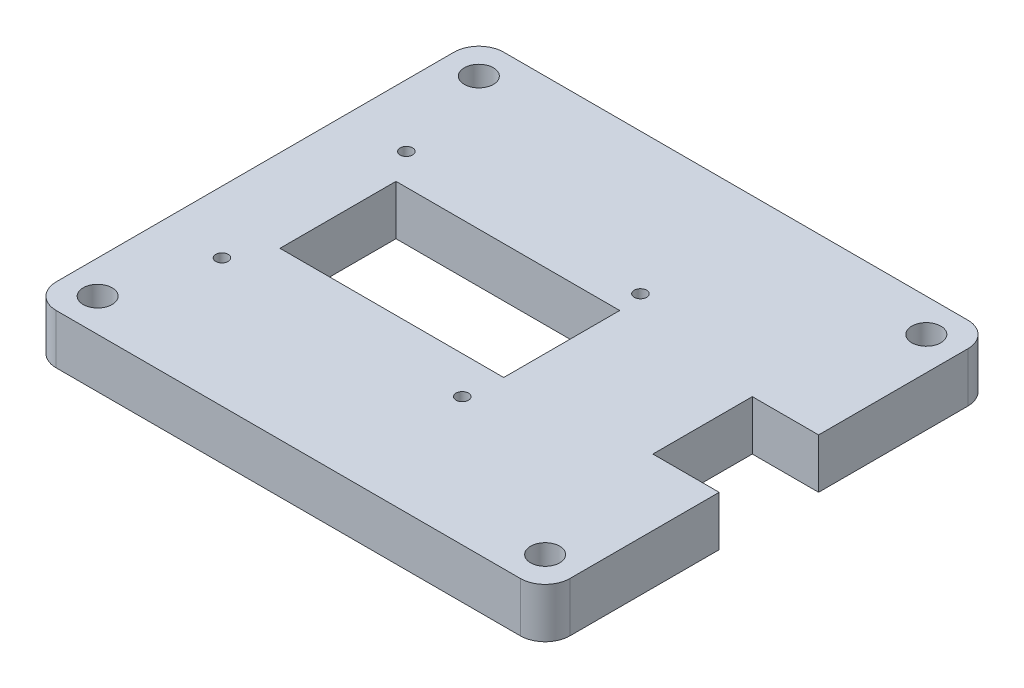
ISO-10303-21;
HEADER;
FILE_DESCRIPTION(('STEP AP214'),'2;1');
FILE_NAME('part.step','',(''),(''),'','','');
FILE_SCHEMA(('AUTOMOTIVE_DESIGN { 1 0 10303 214 1 1 1 1 }'));
ENDSEC;
DATA;
#1=APPLICATION_CONTEXT('core data for automotive mechanical design processes');
#2=APPLICATION_PROTOCOL_DEFINITION('international standard','automotive_design',2000,#1);
#3=PRODUCT_CONTEXT('',#1,'mechanical');
#4=PRODUCT('Part','Part','',(#3));
#5=PRODUCT_RELATED_PRODUCT_CATEGORY('part','',(#4));
#6=PRODUCT_DEFINITION_FORMATION('','',#4);
#7=PRODUCT_DEFINITION_CONTEXT('part definition',#1,'design');
#8=PRODUCT_DEFINITION('design','',#6,#7);
#9=PRODUCT_DEFINITION_SHAPE('','',#8);
#10=(LENGTH_UNIT() NAMED_UNIT(*) SI_UNIT(.MILLI.,.METRE.));
#11=(NAMED_UNIT(*) PLANE_ANGLE_UNIT() SI_UNIT($,.RADIAN.));
#12=(NAMED_UNIT(*) SI_UNIT($,.STERADIAN.) SOLID_ANGLE_UNIT());
#13=UNCERTAINTY_MEASURE_WITH_UNIT(LENGTH_MEASURE(1.E-05),#10,'distance_accuracy_value','');
#14=(GEOMETRIC_REPRESENTATION_CONTEXT(3) GLOBAL_UNCERTAINTY_ASSIGNED_CONTEXT((#13)) GLOBAL_UNIT_ASSIGNED_CONTEXT((#10,
#11,#12)) REPRESENTATION_CONTEXT('',''));
#15=CARTESIAN_POINT('',(0.,0.,0.));
#16=DIRECTION('',(0.,0.,1.));
#17=DIRECTION('',(1.,0.,0.));
#18=AXIS2_PLACEMENT_3D('',#15,#16,#17);
#19=CARTESIAN_POINT('',(52.,6.,-20.));
#20=DIRECTION('',(-1.,0.,0.));
#21=DIRECTION('',(0.,0.,1.));
#22=AXIS2_PLACEMENT_3D('',#19,#20,#21);
#23=PLANE('',#22);
#24=DIRECTION('',(0.,0.,-1.));
#25=VECTOR('',#24,1.);
#26=CARTESIAN_POINT('',(52.,6.,-20.));
#27=LINE('',#26,#25);
#28=CARTESIAN_POINT('',(52.,6.,1.));
#29=VERTEX_POINT('',#28);
#30=CARTESIAN_POINT('',(52.,6.,-17.));
#31=VERTEX_POINT('',#30);
#32=EDGE_CURVE('E56',#29,#31,#27,.T.);
#33=ORIENTED_EDGE('',*,*,#32,.F.);
#34=DIRECTION('',(0.,-1.,0.));
#35=VECTOR('',#34,1.);
#36=CARTESIAN_POINT('',(52.,6.,1.));
#37=LINE('',#36,#35);
#38=CARTESIAN_POINT('',(52.,0.,1.));
#39=VERTEX_POINT('',#38);
#40=EDGE_CURVE('E11',#29,#39,#37,.T.);
#41=ORIENTED_EDGE('',*,*,#40,.T.);
#42=DIRECTION('',(0.,0.,-1.));
#43=VECTOR('',#42,1.);
#44=CARTESIAN_POINT('',(52.,0.,-20.));
#45=LINE('',#44,#43);
#46=CARTESIAN_POINT('',(52.,0.,-17.));
#47=VERTEX_POINT('',#46);
#48=EDGE_CURVE('E276',#39,#47,#45,.T.);
#49=ORIENTED_EDGE('',*,*,#48,.T.);
#50=DIRECTION('',(0.,-1.,0.));
#51=VECTOR('',#50,1.);
#52=CARTESIAN_POINT('',(52.,6.,-17.));
#53=LINE('',#52,#51);
#54=EDGE_CURVE('E315',#47,#31,#53,.F.);
#55=ORIENTED_EDGE('',*,*,#54,.T.);
#56=EDGE_LOOP('',(#33,#41,#49,#55));
#57=FACE_BOUND('',#56,.T.);
#58=ADVANCED_FACE('F33',(#57),#23,.F.);
#59=CARTESIAN_POINT('',(0.,6.,0.));
#60=DIRECTION('',(0.,1.,0.));
#61=DIRECTION('',(0.,0.,1.));
#62=AXIS2_PLACEMENT_3D('',#59,#60,#61);
#63=PLANE('',#62);
#64=DIRECTION('',(-1.,0.,0.));
#65=VECTOR('',#64,1.);
#66=CARTESIAN_POINT('',(60.,6.,1.));
#67=LINE('',#66,#65);
#68=CARTESIAN_POINT('',(44.,6.,1.));
#69=VERTEX_POINT('',#68);
#70=EDGE_CURVE('E169',#29,#69,#67,.T.);
#71=ORIENTED_EDGE('',*,*,#70,.F.);
#72=ORIENTED_EDGE('',*,*,#32,.T.);
#73=CARTESIAN_POINT('',(49.,6.,-17.));
#74=DIRECTION('',(0.,1.,0.));
#75=DIRECTION('',(0.,0.,1.));
#76=AXIS2_PLACEMENT_3D('',#73,#74,#75);
#77=CIRCLE('',#76,3.);
#78=CARTESIAN_POINT('',(49.,6.,-20.));
#79=VERTEX_POINT('',#78);
#80=EDGE_CURVE('E301',#31,#79,#77,.T.);
#81=ORIENTED_EDGE('',*,*,#80,.T.);
#82=DIRECTION('',(-1.,0.,0.));
#83=VECTOR('',#82,1.);
#84=CARTESIAN_POINT('',(-10.,6.,-20.));
#85=LINE('',#84,#83);
#86=CARTESIAN_POINT('',(-7.,6.,-20.));
#87=VERTEX_POINT('',#86);
#88=EDGE_CURVE('E267',#79,#87,#85,.T.);
#89=ORIENTED_EDGE('',*,*,#88,.T.);
#90=CARTESIAN_POINT('',(-7.,6.,-17.));
#91=DIRECTION('',(0.,1.,0.));
#92=DIRECTION('',(0.,0.,1.));
#93=AXIS2_PLACEMENT_3D('',#90,#91,#92);
#94=CIRCLE('',#93,3.);
#95=CARTESIAN_POINT('',(-10.,6.,-17.));
#96=VERTEX_POINT('',#95);
#97=EDGE_CURVE('E305',#87,#96,#94,.T.);
#98=ORIENTED_EDGE('',*,*,#97,.T.);
#99=DIRECTION('',(0.,0.,1.));
#100=VECTOR('',#99,1.);
#101=CARTESIAN_POINT('',(-10.,6.,-20.));
#102=LINE('',#101,#100);
#103=CARTESIAN_POINT('',(-10.,6.,31.));
#104=VERTEX_POINT('',#103);
#105=EDGE_CURVE('E257',#96,#104,#102,.T.);
#106=ORIENTED_EDGE('',*,*,#105,.T.);
#107=CARTESIAN_POINT('',(-7.,6.,31.));
#108=DIRECTION('',(0.,1.,0.));
#109=DIRECTION('',(0.,0.,1.));
#110=AXIS2_PLACEMENT_3D('',#107,#108,#109);
#111=CIRCLE('',#110,3.);
#112=CARTESIAN_POINT('',(-7.,6.,34.));
#113=VERTEX_POINT('',#112);
#114=EDGE_CURVE('E303',#104,#113,#111,.T.);
#115=ORIENTED_EDGE('',*,*,#114,.T.);
#116=DIRECTION('',(1.,0.,0.));
#117=VECTOR('',#116,1.);
#118=CARTESIAN_POINT('',(-10.,6.,34.));
#119=LINE('',#118,#117);
#120=CARTESIAN_POINT('',(49.,6.,34.));
#121=VERTEX_POINT('',#120);
#122=EDGE_CURVE('E260',#113,#121,#119,.T.);
#123=ORIENTED_EDGE('',*,*,#122,.T.);
#124=CARTESIAN_POINT('',(49.,6.,31.));
#125=DIRECTION('',(0.,1.,0.));
#126=DIRECTION('',(0.,0.,1.));
#127=AXIS2_PLACEMENT_3D('',#124,#125,#126);
#128=CIRCLE('',#127,3.);
#129=CARTESIAN_POINT('',(52.,6.,31.));
#130=VERTEX_POINT('',#129);
#131=EDGE_CURVE('E299',#121,#130,#128,.T.);
#132=ORIENTED_EDGE('',*,*,#131,.T.);
#133=CARTESIAN_POINT('',(52.,6.,13.));
#134=VERTEX_POINT('',#133);
#135=EDGE_CURVE('E264',#130,#134,#27,.T.);
#136=ORIENTED_EDGE('',*,*,#135,.T.);
#137=DIRECTION('',(1.,0.,0.));
#138=VECTOR('',#137,1.);
#139=CARTESIAN_POINT('',(60.,6.,13.));
#140=LINE('',#139,#138);
#141=CARTESIAN_POINT('',(44.,6.,13.));
#142=VERTEX_POINT('',#141);
#143=EDGE_CURVE('E48',#142,#134,#140,.T.);
#144=ORIENTED_EDGE('',*,*,#143,.F.);
#145=DIRECTION('',(0.,0.,1.));
#146=VECTOR('',#145,1.);
#147=CARTESIAN_POINT('',(44.,6.,13.));
#148=LINE('',#147,#146);
#149=EDGE_CURVE('E155',#69,#142,#148,.T.);
#150=ORIENTED_EDGE('',*,*,#149,.F.);
#151=EDGE_LOOP('',(#71,#72,#81,#89,#98,#106,#115,#123,#132,#136,#144,#150));
#152=FACE_BOUND('',#151,.T.);
#153=CARTESIAN_POINT('',(-6.,6.,30.));
#154=DIRECTION('',(0.,1.,0.));
#155=DIRECTION('',(0.,0.,1.));
#156=AXIS2_PLACEMENT_3D('',#153,#154,#155);
#157=CIRCLE('',#156,1.75);
#158=CARTESIAN_POINT('',(-6.,6.,31.75));
#159=VERTEX_POINT('',#158);
#160=EDGE_CURVE('E188',#159,#159,#157,.T.);
#161=ORIENTED_EDGE('',*,*,#160,.F.);
#162=EDGE_LOOP('',(#161));
#163=FACE_BOUND('',#162,.T.);
#164=CARTESIAN_POINT('',(48.,6.,-16.));
#165=DIRECTION('',(0.,1.,0.));
#166=DIRECTION('',(0.,0.,1.));
#167=AXIS2_PLACEMENT_3D('',#164,#165,#166);
#168=CIRCLE('',#167,1.75);
#169=CARTESIAN_POINT('',(48.,6.,-14.25));
#170=VERTEX_POINT('',#169);
#171=EDGE_CURVE('E181',#170,#170,#168,.T.);
#172=ORIENTED_EDGE('',*,*,#171,.F.);
#173=EDGE_LOOP('',(#172));
#174=FACE_BOUND('',#173,.T.);
#175=CARTESIAN_POINT('',(48.,6.,30.));
#176=DIRECTION('',(0.,1.,0.));
#177=DIRECTION('',(0.,0.,1.));
#178=AXIS2_PLACEMENT_3D('',#175,#176,#177);
#179=CIRCLE('',#178,1.75);
#180=CARTESIAN_POINT('',(48.,6.,31.75));
#181=VERTEX_POINT('',#180);
#182=EDGE_CURVE('E176',#181,#181,#179,.T.);
#183=ORIENTED_EDGE('',*,*,#182,.F.);
#184=EDGE_LOOP('',(#183));
#185=FACE_BOUND('',#184,.T.);
#186=CARTESIAN_POINT('',(-6.,6.,-16.));
#187=DIRECTION('',(0.,1.,0.));
#188=DIRECTION('',(0.,0.,1.));
#189=AXIS2_PLACEMENT_3D('',#186,#187,#188);
#190=CIRCLE('',#189,1.75);
#191=CARTESIAN_POINT('',(-6.,6.,-14.25));
#192=VERTEX_POINT('',#191);
#193=EDGE_CURVE('E187',#192,#192,#190,.T.);
#194=ORIENTED_EDGE('',*,*,#193,.F.);
#195=EDGE_LOOP('',(#194));
#196=FACE_BOUND('',#195,.T.);
#197=CARTESIAN_POINT('',(-2.5,6.,18.5));
#198=DIRECTION('',(0.,1.,0.));
#199=DIRECTION('',(0.,0.,1.));
#200=AXIS2_PLACEMENT_3D('',#197,#198,#199);
#201=CIRCLE('',#200,0.750000000000001);
#202=CARTESIAN_POINT('',(-2.5,6.,19.25));
#203=VERTEX_POINT('',#202);
#204=EDGE_CURVE('E212',#203,#203,#201,.T.);
#205=ORIENTED_EDGE('',*,*,#204,.F.);
#206=EDGE_LOOP('',(#205));
#207=FACE_BOUND('',#206,.T.);
#208=CARTESIAN_POINT('',(26.5,6.,-2.99999999999999));
#209=DIRECTION('',(0.,1.,0.));
#210=DIRECTION('',(0.,0.,1.));
#211=AXIS2_PLACEMENT_3D('',#208,#209,#210);
#212=CIRCLE('',#211,0.750000000000002);
#213=CARTESIAN_POINT('',(26.5,6.,-2.24999999999999));
#214=VERTEX_POINT('',#213);
#215=EDGE_CURVE('E205',#214,#214,#212,.T.);
#216=ORIENTED_EDGE('',*,*,#215,.F.);
#217=EDGE_LOOP('',(#216));
#218=FACE_BOUND('',#217,.T.);
#219=CARTESIAN_POINT('',(26.5,6.,18.5));
#220=DIRECTION('',(0.,1.,0.));
#221=DIRECTION('',(0.,0.,1.));
#222=AXIS2_PLACEMENT_3D('',#219,#220,#221);
#223=CIRCLE('',#222,0.750000000000002);
#224=CARTESIAN_POINT('',(26.5,6.,19.25));
#225=VERTEX_POINT('',#224);
#226=EDGE_CURVE('E199',#225,#225,#223,.T.);
#227=ORIENTED_EDGE('',*,*,#226,.F.);
#228=EDGE_LOOP('',(#227));
#229=FACE_BOUND('',#228,.T.);
#230=CARTESIAN_POINT('',(-2.5,6.,-3.74999999999999));
#231=DIRECTION('',(0.,1.,0.));
#232=DIRECTION('',(0.,0.,1.));
#233=AXIS2_PLACEMENT_3D('',#230,#231,#232);
#234=CIRCLE('',#233,0.75);
#235=CARTESIAN_POINT('',(-2.5,6.,-2.99999999999999));
#236=VERTEX_POINT('',#235);
#237=EDGE_CURVE('E211',#236,#236,#234,.T.);
#238=ORIENTED_EDGE('',*,*,#237,.F.);
#239=EDGE_LOOP('',(#238));
#240=FACE_BOUND('',#239,.T.);
#241=DIRECTION('',(1.,0.,0.));
#242=VECTOR('',#241,1.);
#243=CARTESIAN_POINT('',(0.,6.,14.));
#244=LINE('',#243,#242);
#245=CARTESIAN_POINT('',(0.,6.,14.));
#246=VERTEX_POINT('',#245);
#247=CARTESIAN_POINT('',(27.,6.,14.));
#248=VERTEX_POINT('',#247);
#249=EDGE_CURVE('E228',#246,#248,#244,.T.);
#250=ORIENTED_EDGE('',*,*,#249,.F.);
#251=DIRECTION('',(0.,0.,1.));
#252=VECTOR('',#251,1.);
#253=CARTESIAN_POINT('',(0.,6.,0.));
#254=LINE('',#253,#252);
#255=CARTESIAN_POINT('',(0.,6.,0.));
#256=VERTEX_POINT('',#255);
#257=EDGE_CURVE('E226',#256,#246,#254,.T.);
#258=ORIENTED_EDGE('',*,*,#257,.F.);
#259=DIRECTION('',(-1.,0.,0.));
#260=VECTOR('',#259,1.);
#261=CARTESIAN_POINT('',(0.,6.,0.));
#262=LINE('',#261,#260);
#263=CARTESIAN_POINT('',(27.,6.,0.));
#264=VERTEX_POINT('',#263);
#265=EDGE_CURVE('E234',#264,#256,#262,.T.);
#266=ORIENTED_EDGE('',*,*,#265,.F.);
#267=DIRECTION('',(0.,0.,-1.));
#268=VECTOR('',#267,1.);
#269=CARTESIAN_POINT('',(27.,6.,0.));
#270=LINE('',#269,#268);
#271=EDGE_CURVE('E231',#248,#264,#270,.T.);
#272=ORIENTED_EDGE('',*,*,#271,.F.);
#273=EDGE_LOOP('',(#250,#258,#266,#272));
#274=FACE_BOUND('',#273,.T.);
#275=ADVANCED_FACE('F320',(#152,#163,#174,#185,#196,#207,#218,#229,#240,#274),#63,.T.);
#276=CARTESIAN_POINT('',(0.,0.,0.));
#277=DIRECTION('',(0.,1.,0.));
#278=DIRECTION('',(0.,0.,1.));
#279=AXIS2_PLACEMENT_3D('',#276,#277,#278);
#280=PLANE('',#279);
#281=CARTESIAN_POINT('',(-6.,0.,30.));
#282=DIRECTION('',(0.,1.,0.));
#283=DIRECTION('',(0.,0.,1.));
#284=AXIS2_PLACEMENT_3D('',#281,#282,#283);
#285=CIRCLE('',#284,1.75);
#286=CARTESIAN_POINT('',(-6.,0.,31.75));
#287=VERTEX_POINT('',#286);
#288=EDGE_CURVE('E184',#287,#287,#285,.T.);
#289=ORIENTED_EDGE('',*,*,#288,.T.);
#290=EDGE_LOOP('',(#289));
#291=FACE_BOUND('',#290,.T.);
#292=CARTESIAN_POINT('',(48.,0.,-16.));
#293=DIRECTION('',(0.,1.,0.));
#294=DIRECTION('',(0.,0.,1.));
#295=AXIS2_PLACEMENT_3D('',#292,#293,#294);
#296=CIRCLE('',#295,1.75);
#297=CARTESIAN_POINT('',(48.,0.,-14.25));
#298=VERTEX_POINT('',#297);
#299=EDGE_CURVE('E191',#298,#298,#296,.T.);
#300=ORIENTED_EDGE('',*,*,#299,.T.);
#301=EDGE_LOOP('',(#300));
#302=FACE_BOUND('',#301,.T.);
#303=CARTESIAN_POINT('',(48.,0.,30.));
#304=DIRECTION('',(0.,1.,0.));
#305=DIRECTION('',(0.,0.,1.));
#306=AXIS2_PLACEMENT_3D('',#303,#304,#305);
#307=CIRCLE('',#306,1.75);
#308=CARTESIAN_POINT('',(48.,0.,31.75));
#309=VERTEX_POINT('',#308);
#310=EDGE_CURVE('E178',#309,#309,#307,.T.);
#311=ORIENTED_EDGE('',*,*,#310,.T.);
#312=EDGE_LOOP('',(#311));
#313=FACE_BOUND('',#312,.T.);
#314=CARTESIAN_POINT('',(-6.,0.,-16.));
#315=DIRECTION('',(0.,1.,0.));
#316=DIRECTION('',(0.,0.,1.));
#317=AXIS2_PLACEMENT_3D('',#314,#315,#316);
#318=CIRCLE('',#317,1.75);
#319=CARTESIAN_POINT('',(-6.,0.,-14.25));
#320=VERTEX_POINT('',#319);
#321=EDGE_CURVE('E196',#320,#320,#318,.T.);
#322=ORIENTED_EDGE('',*,*,#321,.T.);
#323=EDGE_LOOP('',(#322));
#324=FACE_BOUND('',#323,.T.);
#325=CARTESIAN_POINT('',(-2.5,0.,18.5));
#326=DIRECTION('',(0.,1.,0.));
#327=DIRECTION('',(0.,0.,1.));
#328=AXIS2_PLACEMENT_3D('',#325,#326,#327);
#329=CIRCLE('',#328,0.750000000000001);
#330=CARTESIAN_POINT('',(-2.5,0.,19.25));
#331=VERTEX_POINT('',#330);
#332=EDGE_CURVE('E208',#331,#331,#329,.T.);
#333=ORIENTED_EDGE('',*,*,#332,.T.);
#334=EDGE_LOOP('',(#333));
#335=FACE_BOUND('',#334,.T.);
#336=CARTESIAN_POINT('',(26.5,0.,-2.99999999999999));
#337=DIRECTION('',(0.,1.,0.));
#338=DIRECTION('',(0.,0.,1.));
#339=AXIS2_PLACEMENT_3D('',#336,#337,#338);
#340=CIRCLE('',#339,0.750000000000002);
#341=CARTESIAN_POINT('',(26.5,0.,-2.24999999999999));
#342=VERTEX_POINT('',#341);
#343=EDGE_CURVE('E215',#342,#342,#340,.T.);
#344=ORIENTED_EDGE('',*,*,#343,.T.);
#345=EDGE_LOOP('',(#344));
#346=FACE_BOUND('',#345,.T.);
#347=CARTESIAN_POINT('',(26.5,0.,18.5));
#348=DIRECTION('',(0.,1.,0.));
#349=DIRECTION('',(0.,0.,1.));
#350=AXIS2_PLACEMENT_3D('',#347,#348,#349);
#351=CIRCLE('',#350,0.750000000000002);
#352=CARTESIAN_POINT('',(26.5,0.,19.25));
#353=VERTEX_POINT('',#352);
#354=EDGE_CURVE('E202',#353,#353,#351,.T.);
#355=ORIENTED_EDGE('',*,*,#354,.T.);
#356=EDGE_LOOP('',(#355));
#357=FACE_BOUND('',#356,.T.);
#358=CARTESIAN_POINT('',(-2.5,0.,-3.74999999999999));
#359=DIRECTION('',(0.,1.,0.));
#360=DIRECTION('',(0.,0.,1.));
#361=AXIS2_PLACEMENT_3D('',#358,#359,#360);
#362=CIRCLE('',#361,0.75);
#363=CARTESIAN_POINT('',(-2.5,0.,-2.99999999999999));
#364=VERTEX_POINT('',#363);
#365=EDGE_CURVE('E220',#364,#364,#362,.T.);
#366=ORIENTED_EDGE('',*,*,#365,.T.);
#367=EDGE_LOOP('',(#366));
#368=FACE_BOUND('',#367,.T.);
#369=ORIENTED_EDGE('',*,*,#48,.F.);
#370=DIRECTION('',(-1.,0.,0.));
#371=VECTOR('',#370,1.);
#372=CARTESIAN_POINT('',(60.,0.,1.));
#373=LINE('',#372,#371);
#374=CARTESIAN_POINT('',(44.,0.,1.));
#375=VERTEX_POINT('',#374);
#376=EDGE_CURVE('E157',#39,#375,#373,.T.);
#377=ORIENTED_EDGE('',*,*,#376,.T.);
#378=DIRECTION('',(0.,0.,1.));
#379=VECTOR('',#378,1.);
#380=CARTESIAN_POINT('',(44.,0.,13.));
#381=LINE('',#380,#379);
#382=CARTESIAN_POINT('',(44.,0.,13.));
#383=VERTEX_POINT('',#382);
#384=EDGE_CURVE('E152',#375,#383,#381,.T.);
#385=ORIENTED_EDGE('',*,*,#384,.T.);
#386=DIRECTION('',(1.,0.,0.));
#387=VECTOR('',#386,1.);
#388=CARTESIAN_POINT('',(60.,0.,13.));
#389=LINE('',#388,#387);
#390=CARTESIAN_POINT('',(52.,0.,13.));
#391=VERTEX_POINT('',#390);
#392=EDGE_CURVE('E160',#383,#391,#389,.T.);
#393=ORIENTED_EDGE('',*,*,#392,.T.);
#394=CARTESIAN_POINT('',(52.,0.,31.));
#395=VERTEX_POINT('',#394);
#396=EDGE_CURVE('E277',#395,#391,#45,.T.);
#397=ORIENTED_EDGE('',*,*,#396,.F.);
#398=CARTESIAN_POINT('',(49.,0.,31.));
#399=DIRECTION('',(0.,1.,0.));
#400=DIRECTION('',(0.,0.,1.));
#401=AXIS2_PLACEMENT_3D('',#398,#399,#400);
#402=CIRCLE('',#401,3.);
#403=CARTESIAN_POINT('',(49.,0.,34.));
#404=VERTEX_POINT('',#403);
#405=EDGE_CURVE('E285',#395,#404,#402,.F.);
#406=ORIENTED_EDGE('',*,*,#405,.T.);
#407=DIRECTION('',(1.,0.,0.));
#408=VECTOR('',#407,1.);
#409=CARTESIAN_POINT('',(-10.,0.,34.));
#410=LINE('',#409,#408);
#411=CARTESIAN_POINT('',(-7.,0.,34.));
#412=VERTEX_POINT('',#411);
#413=EDGE_CURVE('E273',#412,#404,#410,.T.);
#414=ORIENTED_EDGE('',*,*,#413,.F.);
#415=CARTESIAN_POINT('',(-7.,0.,31.));
#416=DIRECTION('',(0.,1.,0.));
#417=DIRECTION('',(0.,0.,1.));
#418=AXIS2_PLACEMENT_3D('',#415,#416,#417);
#419=CIRCLE('',#418,3.);
#420=CARTESIAN_POINT('',(-10.,0.,31.));
#421=VERTEX_POINT('',#420);
#422=EDGE_CURVE('E290',#412,#421,#419,.F.);
#423=ORIENTED_EDGE('',*,*,#422,.T.);
#424=DIRECTION('',(0.,0.,1.));
#425=VECTOR('',#424,1.);
#426=CARTESIAN_POINT('',(-10.,0.,-20.));
#427=LINE('',#426,#425);
#428=CARTESIAN_POINT('',(-10.,0.,-17.));
#429=VERTEX_POINT('',#428);
#430=EDGE_CURVE('E256',#429,#421,#427,.T.);
#431=ORIENTED_EDGE('',*,*,#430,.F.);
#432=CARTESIAN_POINT('',(-7.,0.,-17.));
#433=DIRECTION('',(0.,1.,0.));
#434=DIRECTION('',(0.,0.,1.));
#435=AXIS2_PLACEMENT_3D('',#432,#433,#434);
#436=CIRCLE('',#435,3.);
#437=CARTESIAN_POINT('',(-7.,0.,-20.));
#438=VERTEX_POINT('',#437);
#439=EDGE_CURVE('E292',#429,#438,#436,.F.);
#440=ORIENTED_EDGE('',*,*,#439,.T.);
#441=DIRECTION('',(-1.,0.,0.));
#442=VECTOR('',#441,1.);
#443=CARTESIAN_POINT('',(-10.,0.,-20.));
#444=LINE('',#443,#442);
#445=CARTESIAN_POINT('',(49.,0.,-20.));
#446=VERTEX_POINT('',#445);
#447=EDGE_CURVE('E261',#446,#438,#444,.T.);
#448=ORIENTED_EDGE('',*,*,#447,.F.);
#449=CARTESIAN_POINT('',(49.,0.,-17.));
#450=DIRECTION('',(0.,1.,0.));
#451=DIRECTION('',(0.,0.,1.));
#452=AXIS2_PLACEMENT_3D('',#449,#450,#451);
#453=CIRCLE('',#452,3.);
#454=EDGE_CURVE('E287',#446,#47,#453,.F.);
#455=ORIENTED_EDGE('',*,*,#454,.T.);
#456=EDGE_LOOP('',(#369,#377,#385,#393,#397,#406,#414,#423,#431,#440,#448,#455));
#457=FACE_BOUND('',#456,.T.);
#458=DIRECTION('',(0.,0.,1.));
#459=VECTOR('',#458,1.);
#460=CARTESIAN_POINT('',(0.,0.,0.));
#461=LINE('',#460,#459);
#462=CARTESIAN_POINT('',(0.,0.,0.));
#463=VERTEX_POINT('',#462);
#464=CARTESIAN_POINT('',(0.,0.,14.));
#465=VERTEX_POINT('',#464);
#466=EDGE_CURVE('E223',#463,#465,#461,.T.);
#467=ORIENTED_EDGE('',*,*,#466,.T.);
#468=DIRECTION('',(1.,0.,0.));
#469=VECTOR('',#468,1.);
#470=CARTESIAN_POINT('',(0.,0.,14.));
#471=LINE('',#470,#469);
#472=CARTESIAN_POINT('',(27.,0.,14.));
#473=VERTEX_POINT('',#472);
#474=EDGE_CURVE('E239',#465,#473,#471,.T.);
#475=ORIENTED_EDGE('',*,*,#474,.T.);
#476=DIRECTION('',(0.,0.,-1.));
#477=VECTOR('',#476,1.);
#478=CARTESIAN_POINT('',(27.,0.,0.));
#479=LINE('',#478,#477);
#480=CARTESIAN_POINT('',(27.,0.,0.));
#481=VERTEX_POINT('',#480);
#482=EDGE_CURVE('E242',#473,#481,#479,.T.);
#483=ORIENTED_EDGE('',*,*,#482,.T.);
#484=DIRECTION('',(-1.,0.,0.));
#485=VECTOR('',#484,1.);
#486=CARTESIAN_POINT('',(0.,0.,0.));
#487=LINE('',#486,#485);
#488=EDGE_CURVE('E229',#481,#463,#487,.T.);
#489=ORIENTED_EDGE('',*,*,#488,.T.);
#490=EDGE_LOOP('',(#467,#475,#483,#489));
#491=FACE_BOUND('',#490,.T.);
#492=ADVANCED_FACE('F167',(#291,#302,#313,#324,#335,#346,#357,#368,#457,#491),#280,.F.);
#493=CARTESIAN_POINT('',(-10.,6.,-20.));
#494=DIRECTION('',(1.,0.,0.));
#495=DIRECTION('',(0.,0.,-1.));
#496=AXIS2_PLACEMENT_3D('',#493,#494,#495);
#497=PLANE('',#496);
#498=ORIENTED_EDGE('',*,*,#105,.F.);
#499=DIRECTION('',(0.,-1.,0.));
#500=VECTOR('',#499,1.);
#501=CARTESIAN_POINT('',(-10.,6.,-17.));
#502=LINE('',#501,#500);
#503=EDGE_CURVE('E282',#96,#429,#502,.T.);
#504=ORIENTED_EDGE('',*,*,#503,.T.);
#505=ORIENTED_EDGE('',*,*,#430,.T.);
#506=DIRECTION('',(0.,-1.,0.));
#507=VECTOR('',#506,1.);
#508=CARTESIAN_POINT('',(-10.,6.,31.));
#509=LINE('',#508,#507);
#510=EDGE_CURVE('E270',#421,#104,#509,.F.);
#511=ORIENTED_EDGE('',*,*,#510,.T.);
#512=EDGE_LOOP('',(#498,#504,#505,#511));
#513=FACE_BOUND('',#512,.T.);
#514=ADVANCED_FACE('F337',(#513),#497,.F.);
#515=CARTESIAN_POINT('',(-10.,6.,34.));
#516=DIRECTION('',(0.,0.,-1.));
#517=DIRECTION('',(-1.,0.,0.));
#518=AXIS2_PLACEMENT_3D('',#515,#516,#517);
#519=PLANE('',#518);
#520=ORIENTED_EDGE('',*,*,#122,.F.);
#521=DIRECTION('',(0.,-1.,0.));
#522=VECTOR('',#521,1.);
#523=CARTESIAN_POINT('',(-7.,6.,34.));
#524=LINE('',#523,#522);
#525=EDGE_CURVE('E309',#113,#412,#524,.T.);
#526=ORIENTED_EDGE('',*,*,#525,.T.);
#527=ORIENTED_EDGE('',*,*,#413,.T.);
#528=DIRECTION('',(0.,-1.,0.));
#529=VECTOR('',#528,1.);
#530=CARTESIAN_POINT('',(49.,6.,34.));
#531=LINE('',#530,#529);
#532=EDGE_CURVE('E307',#404,#121,#531,.F.);
#533=ORIENTED_EDGE('',*,*,#532,.T.);
#534=EDGE_LOOP('',(#520,#526,#527,#533));
#535=FACE_BOUND('',#534,.T.);
#536=ADVANCED_FACE('F328',(#535),#519,.F.);
#537=ORIENTED_EDGE('',*,*,#396,.T.);
#538=DIRECTION('',(0.,1.,0.));
#539=VECTOR('',#538,1.);
#540=CARTESIAN_POINT('',(52.,6.,13.));
#541=LINE('',#540,#539);
#542=EDGE_CURVE('E41',#391,#134,#541,.T.);
#543=ORIENTED_EDGE('',*,*,#542,.T.);
#544=ORIENTED_EDGE('',*,*,#135,.F.);
#545=DIRECTION('',(0.,-1.,0.));
#546=VECTOR('',#545,1.);
#547=CARTESIAN_POINT('',(52.,6.,31.));
#548=LINE('',#547,#546);
#549=EDGE_CURVE('E312',#130,#395,#548,.T.);
#550=ORIENTED_EDGE('',*,*,#549,.T.);
#551=EDGE_LOOP('',(#537,#543,#544,#550));
#552=FACE_BOUND('',#551,.T.);
#553=ADVANCED_FACE('F318',(#552),#23,.F.);
#554=CARTESIAN_POINT('',(-10.,6.,-20.));
#555=DIRECTION('',(0.,0.,1.));
#556=DIRECTION('',(1.,0.,0.));
#557=AXIS2_PLACEMENT_3D('',#554,#555,#556);
#558=PLANE('',#557);
#559=ORIENTED_EDGE('',*,*,#447,.T.);
#560=DIRECTION('',(0.,-1.,0.));
#561=VECTOR('',#560,1.);
#562=CARTESIAN_POINT('',(-7.,6.,-20.));
#563=LINE('',#562,#561);
#564=EDGE_CURVE('E297',#438,#87,#563,.F.);
#565=ORIENTED_EDGE('',*,*,#564,.T.);
#566=ORIENTED_EDGE('',*,*,#88,.F.);
#567=DIRECTION('',(0.,-1.,0.));
#568=VECTOR('',#567,1.);
#569=CARTESIAN_POINT('',(49.,6.,-20.));
#570=LINE('',#569,#568);
#571=EDGE_CURVE('E294',#79,#446,#570,.T.);
#572=ORIENTED_EDGE('',*,*,#571,.T.);
#573=EDGE_LOOP('',(#559,#565,#566,#572));
#574=FACE_BOUND('',#573,.T.);
#575=ADVANCED_FACE('F345',(#574),#558,.F.);
#576=CARTESIAN_POINT('',(0.,6.,0.));
#577=DIRECTION('',(1.,0.,0.));
#578=DIRECTION('',(0.,0.,-1.));
#579=AXIS2_PLACEMENT_3D('',#576,#577,#578);
#580=PLANE('',#579);
#581=ORIENTED_EDGE('',*,*,#466,.F.);
#582=DIRECTION('',(0.,-1.,0.));
#583=VECTOR('',#582,1.);
#584=CARTESIAN_POINT('',(0.,6.,0.));
#585=LINE('',#584,#583);
#586=EDGE_CURVE('E236',#256,#463,#585,.T.);
#587=ORIENTED_EDGE('',*,*,#586,.F.);
#588=ORIENTED_EDGE('',*,*,#257,.T.);
#589=DIRECTION('',(0.,-1.,0.));
#590=VECTOR('',#589,1.);
#591=CARTESIAN_POINT('',(0.,6.,14.));
#592=LINE('',#591,#590);
#593=EDGE_CURVE('E253',#246,#465,#592,.T.);
#594=ORIENTED_EDGE('',*,*,#593,.T.);
#595=EDGE_LOOP('',(#581,#587,#588,#594));
#596=FACE_BOUND('',#595,.T.);
#597=ADVANCED_FACE('F377',(#596),#580,.T.);
#598=CARTESIAN_POINT('',(0.,6.,14.));
#599=DIRECTION('',(0.,0.,-1.));
#600=DIRECTION('',(-1.,0.,0.));
#601=AXIS2_PLACEMENT_3D('',#598,#599,#600);
#602=PLANE('',#601);
#603=ORIENTED_EDGE('',*,*,#474,.F.);
#604=ORIENTED_EDGE('',*,*,#593,.F.);
#605=ORIENTED_EDGE('',*,*,#249,.T.);
#606=DIRECTION('',(0.,-1.,0.));
#607=VECTOR('',#606,1.);
#608=CARTESIAN_POINT('',(27.,6.,14.));
#609=LINE('',#608,#607);
#610=EDGE_CURVE('E251',#248,#473,#609,.T.);
#611=ORIENTED_EDGE('',*,*,#610,.T.);
#612=EDGE_LOOP('',(#603,#604,#605,#611));
#613=FACE_BOUND('',#612,.T.);
#614=ADVANCED_FACE('F460',(#613),#602,.T.);
#615=CARTESIAN_POINT('',(27.,6.,0.));
#616=DIRECTION('',(-1.,0.,0.));
#617=DIRECTION('',(0.,0.,1.));
#618=AXIS2_PLACEMENT_3D('',#615,#616,#617);
#619=PLANE('',#618);
#620=ORIENTED_EDGE('',*,*,#482,.F.);
#621=ORIENTED_EDGE('',*,*,#610,.F.);
#622=ORIENTED_EDGE('',*,*,#271,.T.);
#623=DIRECTION('',(0.,-1.,0.));
#624=VECTOR('',#623,1.);
#625=CARTESIAN_POINT('',(27.,6.,0.));
#626=LINE('',#625,#624);
#627=EDGE_CURVE('E249',#264,#481,#626,.T.);
#628=ORIENTED_EDGE('',*,*,#627,.T.);
#629=EDGE_LOOP('',(#620,#621,#622,#628));
#630=FACE_BOUND('',#629,.T.);
#631=ADVANCED_FACE('F456',(#630),#619,.T.);
#632=CARTESIAN_POINT('',(0.,6.,0.));
#633=DIRECTION('',(0.,0.,1.));
#634=DIRECTION('',(1.,0.,0.));
#635=AXIS2_PLACEMENT_3D('',#632,#633,#634);
#636=PLANE('',#635);
#637=ORIENTED_EDGE('',*,*,#488,.F.);
#638=ORIENTED_EDGE('',*,*,#627,.F.);
#639=ORIENTED_EDGE('',*,*,#265,.T.);
#640=ORIENTED_EDGE('',*,*,#586,.T.);
#641=EDGE_LOOP('',(#637,#638,#639,#640));
#642=FACE_BOUND('',#641,.T.);
#643=ADVANCED_FACE('F452',(#642),#636,.T.);
#644=CARTESIAN_POINT('',(-2.5,0.,-3.74999999999999));
#645=DIRECTION('',(0.,1.,0.));
#646=DIRECTION('',(0.,0.,1.));
#647=AXIS2_PLACEMENT_3D('',#644,#645,#646);
#648=CYLINDRICAL_SURFACE('',#647,0.75);
#649=ORIENTED_EDGE('',*,*,#365,.F.);
#650=EDGE_LOOP('',(#649));
#651=FACE_BOUND('',#650,.T.);
#652=ORIENTED_EDGE('',*,*,#237,.T.);
#653=EDGE_LOOP('',(#652));
#654=FACE_BOUND('',#653,.T.);
#655=ADVANCED_FACE('F442',(#651,#654),#648,.F.);
#656=CARTESIAN_POINT('',(26.5,0.,18.5));
#657=DIRECTION('',(0.,1.,0.));
#658=DIRECTION('',(0.,0.,1.));
#659=AXIS2_PLACEMENT_3D('',#656,#657,#658);
#660=CYLINDRICAL_SURFACE('',#659,0.750000000000002);
#661=ORIENTED_EDGE('',*,*,#354,.F.);
#662=EDGE_LOOP('',(#661));
#663=FACE_BOUND('',#662,.T.);
#664=ORIENTED_EDGE('',*,*,#226,.T.);
#665=EDGE_LOOP('',(#664));
#666=FACE_BOUND('',#665,.T.);
#667=ADVANCED_FACE('F438',(#663,#666),#660,.F.);
#668=CARTESIAN_POINT('',(26.5,0.,-2.99999999999999));
#669=DIRECTION('',(0.,1.,0.));
#670=DIRECTION('',(0.,0.,1.));
#671=AXIS2_PLACEMENT_3D('',#668,#669,#670);
#672=CYLINDRICAL_SURFACE('',#671,0.750000000000002);
#673=ORIENTED_EDGE('',*,*,#343,.F.);
#674=EDGE_LOOP('',(#673));
#675=FACE_BOUND('',#674,.T.);
#676=ORIENTED_EDGE('',*,*,#215,.T.);
#677=EDGE_LOOP('',(#676));
#678=FACE_BOUND('',#677,.T.);
#679=ADVANCED_FACE('F441',(#675,#678),#672,.F.);
#680=CARTESIAN_POINT('',(-2.5,0.,18.5));
#681=DIRECTION('',(0.,1.,0.));
#682=DIRECTION('',(0.,0.,1.));
#683=AXIS2_PLACEMENT_3D('',#680,#681,#682);
#684=CYLINDRICAL_SURFACE('',#683,0.750000000000001);
#685=ORIENTED_EDGE('',*,*,#332,.F.);
#686=EDGE_LOOP('',(#685));
#687=FACE_BOUND('',#686,.T.);
#688=ORIENTED_EDGE('',*,*,#204,.T.);
#689=EDGE_LOOP('',(#688));
#690=FACE_BOUND('',#689,.T.);
#691=ADVANCED_FACE('F436',(#687,#690),#684,.F.);
#692=CARTESIAN_POINT('',(-6.,0.,-16.));
#693=DIRECTION('',(0.,1.,0.));
#694=DIRECTION('',(0.,0.,1.));
#695=AXIS2_PLACEMENT_3D('',#692,#693,#694);
#696=CYLINDRICAL_SURFACE('',#695,1.75);
#697=ORIENTED_EDGE('',*,*,#321,.F.);
#698=EDGE_LOOP('',(#697));
#699=FACE_BOUND('',#698,.T.);
#700=ORIENTED_EDGE('',*,*,#193,.T.);
#701=EDGE_LOOP('',(#700));
#702=FACE_BOUND('',#701,.T.);
#703=ADVANCED_FACE('F426',(#699,#702),#696,.F.);
#704=CARTESIAN_POINT('',(48.,0.,30.));
#705=DIRECTION('',(0.,1.,0.));
#706=DIRECTION('',(0.,0.,1.));
#707=AXIS2_PLACEMENT_3D('',#704,#705,#706);
#708=CYLINDRICAL_SURFACE('',#707,1.75);
#709=ORIENTED_EDGE('',*,*,#310,.F.);
#710=EDGE_LOOP('',(#709));
#711=FACE_BOUND('',#710,.T.);
#712=ORIENTED_EDGE('',*,*,#182,.T.);
#713=EDGE_LOOP('',(#712));
#714=FACE_BOUND('',#713,.T.);
#715=ADVANCED_FACE('F422',(#711,#714),#708,.F.);
#716=CARTESIAN_POINT('',(48.,0.,-16.));
#717=DIRECTION('',(0.,1.,0.));
#718=DIRECTION('',(0.,0.,1.));
#719=AXIS2_PLACEMENT_3D('',#716,#717,#718);
#720=CYLINDRICAL_SURFACE('',#719,1.75);
#721=ORIENTED_EDGE('',*,*,#299,.F.);
#722=EDGE_LOOP('',(#721));
#723=FACE_BOUND('',#722,.T.);
#724=ORIENTED_EDGE('',*,*,#171,.T.);
#725=EDGE_LOOP('',(#724));
#726=FACE_BOUND('',#725,.T.);
#727=ADVANCED_FACE('F425',(#723,#726),#720,.F.);
#728=CARTESIAN_POINT('',(-6.,0.,30.));
#729=DIRECTION('',(0.,1.,0.));
#730=DIRECTION('',(0.,0.,1.));
#731=AXIS2_PLACEMENT_3D('',#728,#729,#730);
#732=CYLINDRICAL_SURFACE('',#731,1.75);
#733=ORIENTED_EDGE('',*,*,#288,.F.);
#734=EDGE_LOOP('',(#733));
#735=FACE_BOUND('',#734,.T.);
#736=ORIENTED_EDGE('',*,*,#160,.T.);
#737=EDGE_LOOP('',(#736));
#738=FACE_BOUND('',#737,.T.);
#739=ADVANCED_FACE('F386',(#735,#738),#732,.F.);
#740=CARTESIAN_POINT('',(-7.,6.,-17.));
#741=DIRECTION('',(0.,-1.,0.));
#742=DIRECTION('',(0.,0.,-1.));
#743=AXIS2_PLACEMENT_3D('',#740,#741,#742);
#744=CYLINDRICAL_SURFACE('',#743,3.);
#745=ORIENTED_EDGE('',*,*,#97,.F.);
#746=ORIENTED_EDGE('',*,*,#564,.F.);
#747=ORIENTED_EDGE('',*,*,#439,.F.);
#748=ORIENTED_EDGE('',*,*,#503,.F.);
#749=EDGE_LOOP('',(#745,#746,#747,#748));
#750=FACE_BOUND('',#749,.T.);
#751=ADVANCED_FACE('F341',(#750),#744,.T.);
#752=CARTESIAN_POINT('',(-7.,6.,31.));
#753=DIRECTION('',(0.,-1.,0.));
#754=DIRECTION('',(0.,0.,-1.));
#755=AXIS2_PLACEMENT_3D('',#752,#753,#754);
#756=CYLINDRICAL_SURFACE('',#755,3.);
#757=ORIENTED_EDGE('',*,*,#114,.F.);
#758=ORIENTED_EDGE('',*,*,#510,.F.);
#759=ORIENTED_EDGE('',*,*,#422,.F.);
#760=ORIENTED_EDGE('',*,*,#525,.F.);
#761=EDGE_LOOP('',(#757,#758,#759,#760));
#762=FACE_BOUND('',#761,.T.);
#763=ADVANCED_FACE('F332',(#762),#756,.T.);
#764=CARTESIAN_POINT('',(49.,6.,-17.));
#765=DIRECTION('',(0.,-1.,0.));
#766=DIRECTION('',(0.,0.,-1.));
#767=AXIS2_PLACEMENT_3D('',#764,#765,#766);
#768=CYLINDRICAL_SURFACE('',#767,3.);
#769=ORIENTED_EDGE('',*,*,#80,.F.);
#770=ORIENTED_EDGE('',*,*,#54,.F.);
#771=ORIENTED_EDGE('',*,*,#454,.F.);
#772=ORIENTED_EDGE('',*,*,#571,.F.);
#773=EDGE_LOOP('',(#769,#770,#771,#772));
#774=FACE_BOUND('',#773,.T.);
#775=ADVANCED_FACE('F350',(#774),#768,.T.);
#776=CARTESIAN_POINT('',(49.,6.,31.));
#777=DIRECTION('',(0.,-1.,0.));
#778=DIRECTION('',(0.,0.,-1.));
#779=AXIS2_PLACEMENT_3D('',#776,#777,#778);
#780=CYLINDRICAL_SURFACE('',#779,3.);
#781=ORIENTED_EDGE('',*,*,#131,.F.);
#782=ORIENTED_EDGE('',*,*,#532,.F.);
#783=ORIENTED_EDGE('',*,*,#405,.F.);
#784=ORIENTED_EDGE('',*,*,#549,.F.);
#785=EDGE_LOOP('',(#781,#782,#783,#784));
#786=FACE_BOUND('',#785,.T.);
#787=ADVANCED_FACE('F35',(#786),#780,.T.);
#788=CARTESIAN_POINT('',(60.,0.,1.));
#789=DIRECTION('',(0.,0.,-1.));
#790=DIRECTION('',(-1.,0.,0.));
#791=AXIS2_PLACEMENT_3D('',#788,#789,#790);
#792=PLANE('',#791);
#793=ORIENTED_EDGE('',*,*,#70,.T.);
#794=DIRECTION('',(0.,1.,0.));
#795=VECTOR('',#794,1.);
#796=CARTESIAN_POINT('',(44.,0.,1.));
#797=LINE('',#796,#795);
#798=EDGE_CURVE('E156',#375,#69,#797,.T.);
#799=ORIENTED_EDGE('',*,*,#798,.F.);
#800=ORIENTED_EDGE('',*,*,#376,.F.);
#801=ORIENTED_EDGE('',*,*,#40,.F.);
#802=EDGE_LOOP('',(#793,#799,#800,#801));
#803=FACE_BOUND('',#802,.T.);
#804=ADVANCED_FACE('F354',(#803),#792,.F.);
#805=CARTESIAN_POINT('',(60.,0.,13.));
#806=DIRECTION('',(0.,0.,1.));
#807=DIRECTION('',(1.,0.,0.));
#808=AXIS2_PLACEMENT_3D('',#805,#806,#807);
#809=PLANE('',#808);
#810=ORIENTED_EDGE('',*,*,#392,.F.);
#811=DIRECTION('',(0.,1.,0.));
#812=VECTOR('',#811,1.);
#813=CARTESIAN_POINT('',(44.,0.,13.));
#814=LINE('',#813,#812);
#815=EDGE_CURVE('E147',#383,#142,#814,.T.);
#816=ORIENTED_EDGE('',*,*,#815,.T.);
#817=ORIENTED_EDGE('',*,*,#143,.T.);
#818=ORIENTED_EDGE('',*,*,#542,.F.);
#819=EDGE_LOOP('',(#810,#816,#817,#818));
#820=FACE_BOUND('',#819,.T.);
#821=ADVANCED_FACE('F161',(#820),#809,.F.);
#822=CARTESIAN_POINT('',(44.,0.,13.));
#823=DIRECTION('',(-1.,0.,0.));
#824=DIRECTION('',(0.,0.,1.));
#825=AXIS2_PLACEMENT_3D('',#822,#823,#824);
#826=PLANE('',#825);
#827=ORIENTED_EDGE('',*,*,#149,.T.);
#828=ORIENTED_EDGE('',*,*,#815,.F.);
#829=ORIENTED_EDGE('',*,*,#384,.F.);
#830=ORIENTED_EDGE('',*,*,#798,.T.);
#831=EDGE_LOOP('',(#827,#828,#829,#830));
#832=FACE_BOUND('',#831,.T.);
#833=ADVANCED_FACE('F149',(#832),#826,.F.);
#834=CLOSED_SHELL('',(#58,#275,#492,#514,#536,#553,#575,#597,#614,#631,#643,#655,#667,#679,#691,
#703,#715,#727,#739,#751,#763,#775,#787,#804,#821,#833));
#835=MANIFOLD_SOLID_BREP('B2',#834);
#836=ADVANCED_BREP_SHAPE_REPRESENTATION('',(#18,#835),#14);
#837=SHAPE_DEFINITION_REPRESENTATION(#9,#836);
ENDSEC;
END-ISO-10303-21;
